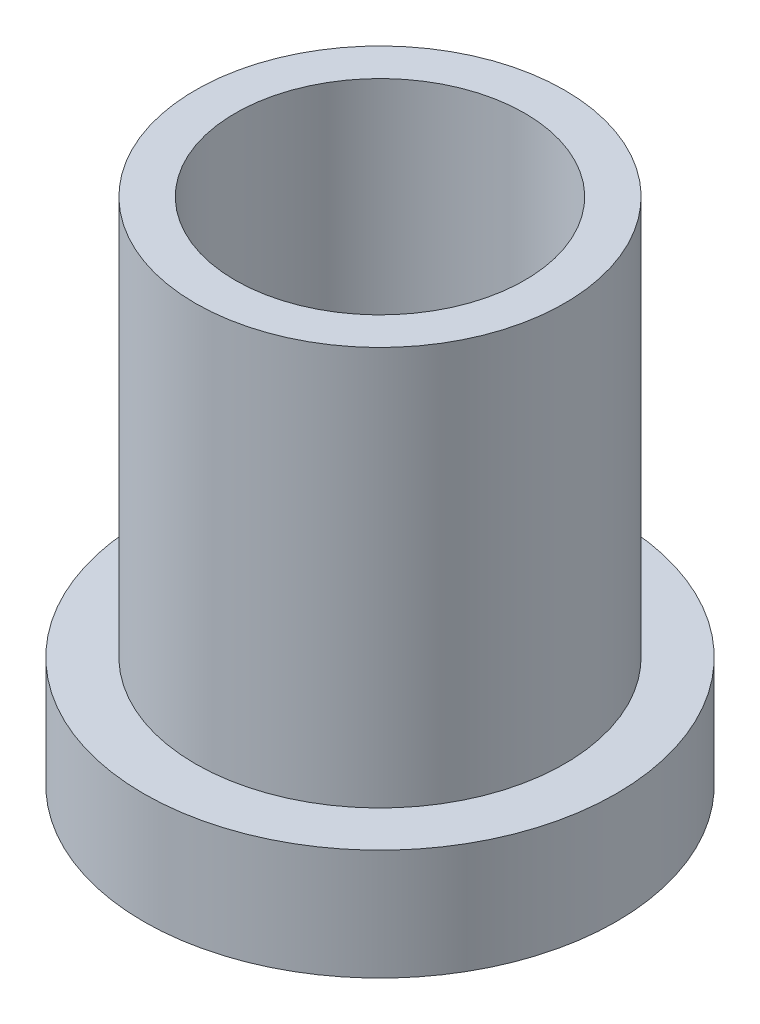
ISO-10303-21;
HEADER;
FILE_DESCRIPTION(('STEP AP214'),'2;1');
FILE_NAME('part.step','',(''),(''),'','','');
FILE_SCHEMA(('AUTOMOTIVE_DESIGN { 1 0 10303 214 1 1 1 1 }'));
ENDSEC;
DATA;
#1=APPLICATION_CONTEXT('core data for automotive mechanical design processes');
#2=APPLICATION_PROTOCOL_DEFINITION('international standard','automotive_design',2000,#1);
#3=PRODUCT_CONTEXT('',#1,'mechanical');
#4=PRODUCT('Part','Part','',(#3));
#5=PRODUCT_RELATED_PRODUCT_CATEGORY('part','',(#4));
#6=PRODUCT_DEFINITION_FORMATION('','',#4);
#7=PRODUCT_DEFINITION_CONTEXT('part definition',#1,'design');
#8=PRODUCT_DEFINITION('design','',#6,#7);
#9=PRODUCT_DEFINITION_SHAPE('','',#8);
#10=(LENGTH_UNIT() NAMED_UNIT(*) SI_UNIT(.MILLI.,.METRE.));
#11=(NAMED_UNIT(*) PLANE_ANGLE_UNIT() SI_UNIT($,.RADIAN.));
#12=(NAMED_UNIT(*) SI_UNIT($,.STERADIAN.) SOLID_ANGLE_UNIT());
#13=UNCERTAINTY_MEASURE_WITH_UNIT(LENGTH_MEASURE(1.E-05),#10,'distance_accuracy_value','');
#14=(GEOMETRIC_REPRESENTATION_CONTEXT(3) GLOBAL_UNCERTAINTY_ASSIGNED_CONTEXT((#13)) GLOBAL_UNIT_ASSIGNED_CONTEXT((#10,
#11,#12)) REPRESENTATION_CONTEXT('',''));
#15=CARTESIAN_POINT('',(0.,0.,0.));
#16=DIRECTION('',(0.,0.,1.));
#17=DIRECTION('',(1.,0.,0.));
#18=AXIS2_PLACEMENT_3D('',#15,#16,#17);
#19=CARTESIAN_POINT('',(0.,6.858,0.));
#20=DIRECTION('',(0.,1.,0.));
#21=DIRECTION('',(0.,0.,1.));
#22=AXIS2_PLACEMENT_3D('',#19,#20,#21);
#23=PLANE('',#22);
#24=CARTESIAN_POINT('',(0.,6.858,0.));
#25=DIRECTION('',(0.,1.,0.));
#26=DIRECTION('',(0.,0.,1.));
#27=AXIS2_PLACEMENT_3D('',#24,#25,#26);
#28=CIRCLE('',#27,3.175);
#29=CARTESIAN_POINT('',(0.,6.858,3.175));
#30=VERTEX_POINT('',#29);
#31=EDGE_CURVE('E10',#30,#30,#28,.T.);
#32=ORIENTED_EDGE('',*,*,#31,.T.);
#33=EDGE_LOOP('',(#32));
#34=FACE_BOUND('',#33,.T.);
#35=CARTESIAN_POINT('',(0.,6.858,0.));
#36=DIRECTION('',(0.,1.,0.));
#37=DIRECTION('',(0.,0.,1.));
#38=AXIS2_PLACEMENT_3D('',#35,#36,#37);
#39=CIRCLE('',#38,2.4892);
#40=CARTESIAN_POINT('',(0.,6.858,2.4892));
#41=VERTEX_POINT('',#40);
#42=EDGE_CURVE('E45',#41,#41,#39,.T.);
#43=ORIENTED_EDGE('',*,*,#42,.F.);
#44=EDGE_LOOP('',(#43));
#45=FACE_BOUND('',#44,.T.);
#46=ADVANCED_FACE('F37',(#34,#45),#23,.T.);
#47=CARTESIAN_POINT('',(0.,6.858,0.));
#48=DIRECTION('',(0.,-1.,0.));
#49=DIRECTION('',(0.,0.,-1.));
#50=AXIS2_PLACEMENT_3D('',#47,#48,#49);
#51=CYLINDRICAL_SURFACE('',#50,3.175);
#52=ORIENTED_EDGE('',*,*,#31,.F.);
#53=EDGE_LOOP('',(#52));
#54=FACE_BOUND('',#53,.T.);
#55=CARTESIAN_POINT('',(0.,0.,0.));
#56=DIRECTION('',(0.,1.,0.));
#57=DIRECTION('',(0.,0.,1.));
#58=AXIS2_PLACEMENT_3D('',#55,#56,#57);
#59=CIRCLE('',#58,3.175);
#60=CARTESIAN_POINT('',(0.,0.,3.175));
#61=VERTEX_POINT('',#60);
#62=EDGE_CURVE('E41',#61,#61,#59,.T.);
#63=ORIENTED_EDGE('',*,*,#62,.T.);
#64=EDGE_LOOP('',(#63));
#65=FACE_BOUND('',#64,.T.);
#66=ADVANCED_FACE('F39',(#54,#65),#51,.T.);
#67=CARTESIAN_POINT('',(0.,6.858,0.));
#68=DIRECTION('',(0.,-1.,0.));
#69=DIRECTION('',(0.,0.,-1.));
#70=AXIS2_PLACEMENT_3D('',#67,#68,#69);
#71=CYLINDRICAL_SURFACE('',#70,2.4892);
#72=ORIENTED_EDGE('',*,*,#42,.T.);
#73=EDGE_LOOP('',(#72));
#74=FACE_BOUND('',#73,.T.);
#75=CARTESIAN_POINT('',(0.,-1.905,0.));
#76=DIRECTION('',(0.,-1.,0.));
#77=DIRECTION('',(0.,0.,-1.));
#78=AXIS2_PLACEMENT_3D('',#75,#76,#77);
#79=CIRCLE('',#78,2.4892);
#80=CARTESIAN_POINT('',(0.,-1.905,-2.4892));
#81=VERTEX_POINT('',#80);
#82=EDGE_CURVE('E55',#81,#81,#79,.T.);
#83=ORIENTED_EDGE('',*,*,#82,.T.);
#84=EDGE_LOOP('',(#83));
#85=FACE_BOUND('',#84,.T.);
#86=ADVANCED_FACE('F61',(#74,#85),#71,.F.);
#87=CARTESIAN_POINT('',(0.,-1.905,0.));
#88=DIRECTION('',(0.,1.,0.));
#89=DIRECTION('',(0.,0.,1.));
#90=AXIS2_PLACEMENT_3D('',#87,#88,#89);
#91=CYLINDRICAL_SURFACE('',#90,4.064);
#92=CARTESIAN_POINT('',(0.,-1.905,0.));
#93=DIRECTION('',(0.,-1.,0.));
#94=DIRECTION('',(0.,0.,-1.));
#95=AXIS2_PLACEMENT_3D('',#92,#93,#94);
#96=CIRCLE('',#95,4.064);
#97=CARTESIAN_POINT('',(0.,-1.905,4.064));
#98=VERTEX_POINT('',#97);
#99=EDGE_CURVE('E54',#98,#98,#96,.T.);
#100=CARTESIAN_POINT('',(0.,0.,0.));
#101=DIRECTION('',(0.,-1.,0.));
#102=DIRECTION('',(0.,0.,-1.));
#103=AXIS2_PLACEMENT_3D('',#100,#101,#102);
#104=CIRCLE('',#103,4.064);
#105=CARTESIAN_POINT('',(0.,0.,4.064));
#106=VERTEX_POINT('',#105);
#107=EDGE_CURVE('E51',#106,#106,#104,.T.);
#108=CARTESIAN_POINT('',(0.,-1.905,4.064));
#109=CARTESIAN_POINT('',(0.,-1.88515625,4.064));
#110=CARTESIAN_POINT('',(0.,-1.8653125,4.064));
#111=CARTESIAN_POINT('',(0.,-1.825625,4.064));
#112=CARTESIAN_POINT('',(0.,-1.80578125,4.064));
#113=CARTESIAN_POINT('',(0.,-1.76609375,4.064));
#114=CARTESIAN_POINT('',(0.,-1.74625,4.064));
#115=CARTESIAN_POINT('',(0.,-1.7065625,4.064));
#116=CARTESIAN_POINT('',(0.,-1.68671875,4.064));
#117=CARTESIAN_POINT('',(0.,-1.64703125,4.064));
#118=CARTESIAN_POINT('',(0.,-1.6271875,4.064));
#119=CARTESIAN_POINT('',(0.,-1.5875,4.064));
#120=CARTESIAN_POINT('',(0.,-1.56765625,4.064));
#121=CARTESIAN_POINT('',(0.,-1.52796875,4.064));
#122=CARTESIAN_POINT('',(0.,-1.508125,4.064));
#123=CARTESIAN_POINT('',(0.,-1.4684375,4.064));
#124=CARTESIAN_POINT('',(0.,-1.44859375,4.064));
#125=CARTESIAN_POINT('',(0.,-1.40890625,4.064));
#126=CARTESIAN_POINT('',(0.,-1.3890625,4.064));
#127=CARTESIAN_POINT('',(0.,-1.349375,4.064));
#128=CARTESIAN_POINT('',(0.,-1.32953125,4.064));
#129=CARTESIAN_POINT('',(0.,-1.28984375,4.064));
#130=CARTESIAN_POINT('',(0.,-1.27,4.064));
#131=CARTESIAN_POINT('',(0.,-1.2303125,4.064));
#132=CARTESIAN_POINT('',(0.,-1.21046875,4.064));
#133=CARTESIAN_POINT('',(0.,-1.17078125,4.064));
#134=CARTESIAN_POINT('',(0.,-1.1509375,4.064));
#135=CARTESIAN_POINT('',(0.,-1.11125,4.064));
#136=CARTESIAN_POINT('',(0.,-1.09140625,4.064));
#137=CARTESIAN_POINT('',(0.,-1.05171875,4.064));
#138=CARTESIAN_POINT('',(0.,-1.031875,4.064));
#139=CARTESIAN_POINT('',(0.,-0.9921875,4.064));
#140=CARTESIAN_POINT('',(0.,-0.97234375,4.064));
#141=CARTESIAN_POINT('',(0.,-0.93265625,4.064));
#142=CARTESIAN_POINT('',(0.,-0.9128125,4.064));
#143=CARTESIAN_POINT('',(0.,-0.873125,4.064));
#144=CARTESIAN_POINT('',(0.,-0.85328125,4.064));
#145=CARTESIAN_POINT('',(0.,-0.81359375,4.064));
#146=CARTESIAN_POINT('',(0.,-0.79375,4.064));
#147=CARTESIAN_POINT('',(0.,-0.7540625,4.064));
#148=CARTESIAN_POINT('',(0.,-0.73421875,4.064));
#149=CARTESIAN_POINT('',(0.,-0.69453125,4.064));
#150=CARTESIAN_POINT('',(0.,-0.6746875,4.064));
#151=CARTESIAN_POINT('',(0.,-0.635,4.064));
#152=CARTESIAN_POINT('',(0.,-0.61515625,4.064));
#153=CARTESIAN_POINT('',(0.,-0.57546875,4.064));
#154=CARTESIAN_POINT('',(0.,-0.555625,4.064));
#155=CARTESIAN_POINT('',(0.,-0.5159375,4.064));
#156=CARTESIAN_POINT('',(0.,-0.49609375,4.064));
#157=CARTESIAN_POINT('',(0.,-0.45640625,4.064));
#158=CARTESIAN_POINT('',(0.,-0.4365625,4.064));
#159=CARTESIAN_POINT('',(0.,-0.396875,4.064));
#160=CARTESIAN_POINT('',(0.,-0.37703125,4.064));
#161=CARTESIAN_POINT('',(0.,-0.33734375,4.064));
#162=CARTESIAN_POINT('',(0.,-0.3175,4.064));
#163=CARTESIAN_POINT('',(0.,-0.2778125,4.064));
#164=CARTESIAN_POINT('',(0.,-0.25796875,4.064));
#165=CARTESIAN_POINT('',(0.,-0.21828125,4.064));
#166=CARTESIAN_POINT('',(0.,-0.1984375,4.064));
#167=CARTESIAN_POINT('',(0.,-0.15875,4.064));
#168=CARTESIAN_POINT('',(0.,-0.13890625,4.064));
#169=CARTESIAN_POINT('',(0.,-0.09921875,4.064));
#170=CARTESIAN_POINT('',(0.,-0.0793749999999999,4.064));
#171=CARTESIAN_POINT('',(0.,-0.0396874999999999,4.064));
#172=CARTESIAN_POINT('',(0.,-0.01984375,4.064));
#173=CARTESIAN_POINT('',(0.,0.,4.064));
#174=B_SPLINE_CURVE_WITH_KNOTS('',3,(#108,#109,#110,#111,#112,#113,#114,#115,#116,#117,#118,
#119,#120,#121,#122,#123,#124,#125,#126,#127,#128,#129,#130,#131,#132,#133,#134,#135,#136,#137,
#138,#139,#140,#141,#142,#143,#144,#145,#146,#147,#148,#149,#150,#151,#152,#153,#154,#155,#156,
#157,#158,#159,#160,#161,#162,#163,#164,#165,#166,#167,#168,#169,#170,#171,#172,#173),
.UNSPECIFIED.,.F.,.F.,(4,2,2,2,2,2,2,2,2,2,2,2,2,2,2,2,2,2,2,2,2,2,2,2,2,2,2,2,2,2,2,2,4),(0.,
0.0595312500000001,0.1190625,0.17859375,0.238125,0.29765625,0.3571875,0.41671875,0.47625,
0.53578125,0.5953125,0.65484375,0.714375,0.77390625,0.8334375,0.89296875,0.9525,1.01203125,
1.0715625,1.13109375,1.190625,1.25015625,1.3096875,1.36921875,1.42875,1.48828125,1.5478125,
1.60734375,1.666875,1.72640625,1.7859375,1.84546875,1.905),.UNSPECIFIED.);
#175=EDGE_CURVE('BSEAM67',#98,#106,#174,.T.);
#176=ORIENTED_EDGE('',*,*,#99,.F.);
#177=ORIENTED_EDGE('',*,*,#107,.T.);
#178=ORIENTED_EDGE('',*,*,#175,.T.);
#179=ORIENTED_EDGE('',*,*,#175,.F.);
#180=EDGE_LOOP('',(#176,#178,#177,#179));
#181=FACE_BOUND('',#180,.T.);
#182=ADVANCED_FACE('F67',(#181),#91,.T.);
#183=CARTESIAN_POINT('',(0.,-1.905,0.));
#184=DIRECTION('',(0.,-1.,0.));
#185=DIRECTION('',(0.,0.,-1.));
#186=AXIS2_PLACEMENT_3D('',#183,#184,#185);
#187=PLANE('',#186);
#188=ORIENTED_EDGE('',*,*,#82,.F.);
#189=EDGE_LOOP('',(#188));
#190=FACE_BOUND('',#189,.T.);
#191=ORIENTED_EDGE('',*,*,#99,.T.);
#192=EDGE_LOOP('',(#191));
#193=FACE_BOUND('',#192,.T.);
#194=ADVANCED_FACE('F63',(#190,#193),#187,.T.);
#195=CARTESIAN_POINT('',(0.,0.,0.));
#196=DIRECTION('',(0.,-1.,0.));
#197=DIRECTION('',(0.,0.,-1.));
#198=AXIS2_PLACEMENT_3D('',#195,#196,#197);
#199=PLANE('',#198);
#200=ORIENTED_EDGE('',*,*,#62,.F.);
#201=EDGE_LOOP('',(#200));
#202=FACE_BOUND('',#201,.T.);
#203=ORIENTED_EDGE('',*,*,#107,.F.);
#204=EDGE_LOOP('',(#203));
#205=FACE_BOUND('',#204,.T.);
#206=ADVANCED_FACE('F66',(#202,#205),#199,.F.);
#207=CLOSED_SHELL('',(#46,#66,#86,#182,#194,#206));
#208=MANIFOLD_SOLID_BREP('B2',#207);
#209=ADVANCED_BREP_SHAPE_REPRESENTATION('',(#18,#208),#14);
#210=SHAPE_DEFINITION_REPRESENTATION(#9,#209);
ENDSEC;
END-ISO-10303-21;
